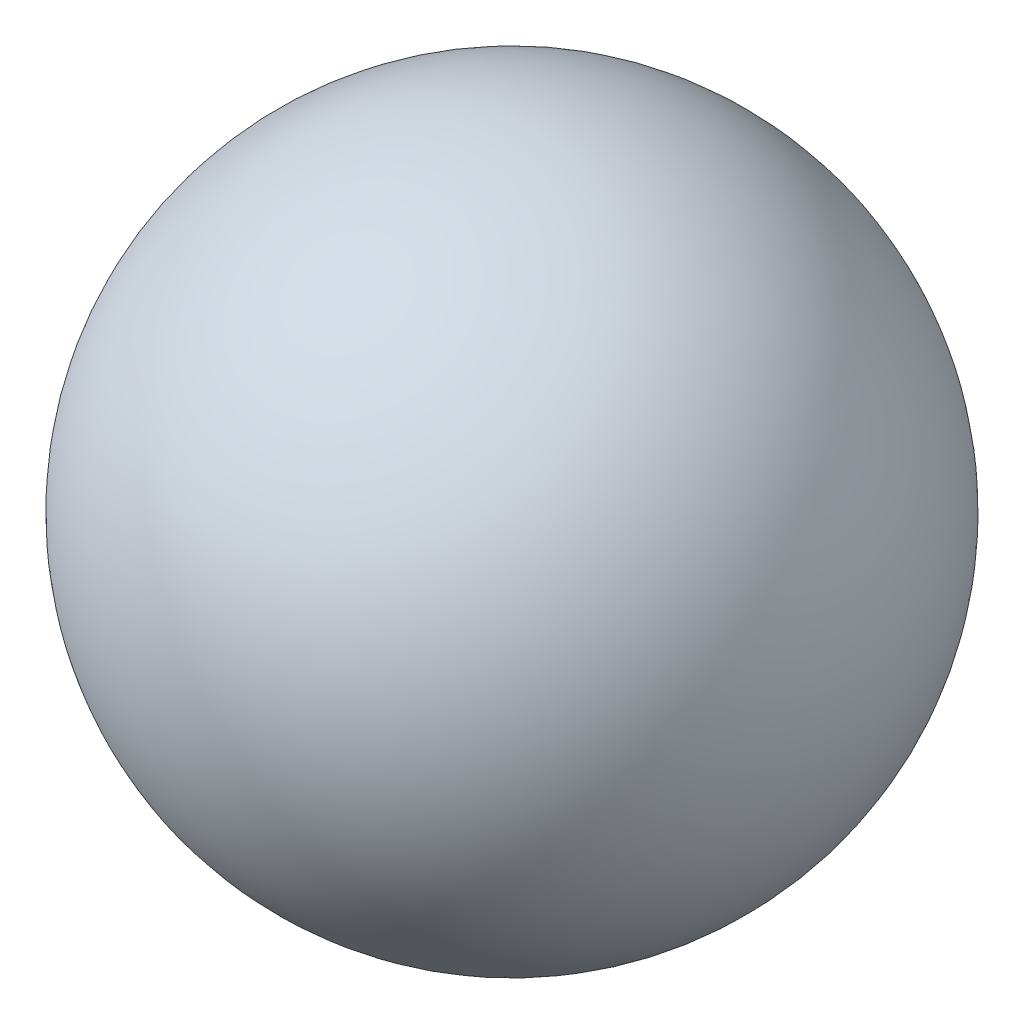
ISO-10303-21;
HEADER;
FILE_DESCRIPTION(('STEP AP214'),'2;1');
FILE_NAME('part.step','',(''),(''),'','','');
FILE_SCHEMA(('AUTOMOTIVE_DESIGN { 1 0 10303 214 1 1 1 1 }'));
ENDSEC;
DATA;
#1=APPLICATION_CONTEXT('core data for automotive mechanical design processes');
#2=APPLICATION_PROTOCOL_DEFINITION('international standard','automotive_design',2000,#1);
#3=PRODUCT_CONTEXT('',#1,'mechanical');
#4=PRODUCT('Part','Part','',(#3));
#5=PRODUCT_RELATED_PRODUCT_CATEGORY('part','',(#4));
#6=PRODUCT_DEFINITION_FORMATION('','',#4);
#7=PRODUCT_DEFINITION_CONTEXT('part definition',#1,'design');
#8=PRODUCT_DEFINITION('design','',#6,#7);
#9=PRODUCT_DEFINITION_SHAPE('','',#8);
#10=(LENGTH_UNIT() NAMED_UNIT(*) SI_UNIT(.MILLI.,.METRE.));
#11=(NAMED_UNIT(*) PLANE_ANGLE_UNIT() SI_UNIT($,.RADIAN.));
#12=(NAMED_UNIT(*) SI_UNIT($,.STERADIAN.) SOLID_ANGLE_UNIT());
#13=UNCERTAINTY_MEASURE_WITH_UNIT(LENGTH_MEASURE(1.E-05),#10,'distance_accuracy_value','');
#14=(GEOMETRIC_REPRESENTATION_CONTEXT(3) GLOBAL_UNCERTAINTY_ASSIGNED_CONTEXT((#13)) GLOBAL_UNIT_ASSIGNED_CONTEXT((#10,
#11,#12)) REPRESENTATION_CONTEXT('',''));
#15=CARTESIAN_POINT('',(0.,0.,0.));
#16=DIRECTION('',(0.,0.,1.));
#17=DIRECTION('',(1.,0.,0.));
#18=AXIS2_PLACEMENT_3D('',#15,#16,#17);
#19=CARTESIAN_POINT('',(0.,0.,0.));
#20=DIRECTION('',(0.,0.,-1.));
#21=DIRECTION('',(1.,0.,0.));
#22=AXIS2_PLACEMENT_3D('',#19,#20,#21);
#23=SPHERICAL_SURFACE('',#22,36.83);
#24=CARTESIAN_POINT('',(0.,0.,-36.83));
#25=VERTEX_POINT('',#24);
#26=VERTEX_LOOP('',#25);
#27=FACE_BOUND('',#26,.T.);
#28=ADVANCED_FACE('F30',(#27),#23,.T.);
#29=CLOSED_SHELL('',(#28));
#30=MANIFOLD_SOLID_BREP('B2',#29);
#31=ADVANCED_BREP_SHAPE_REPRESENTATION('',(#18,#30),#14);
#32=SHAPE_DEFINITION_REPRESENTATION(#9,#31);
ENDSEC;
END-ISO-10303-21;
